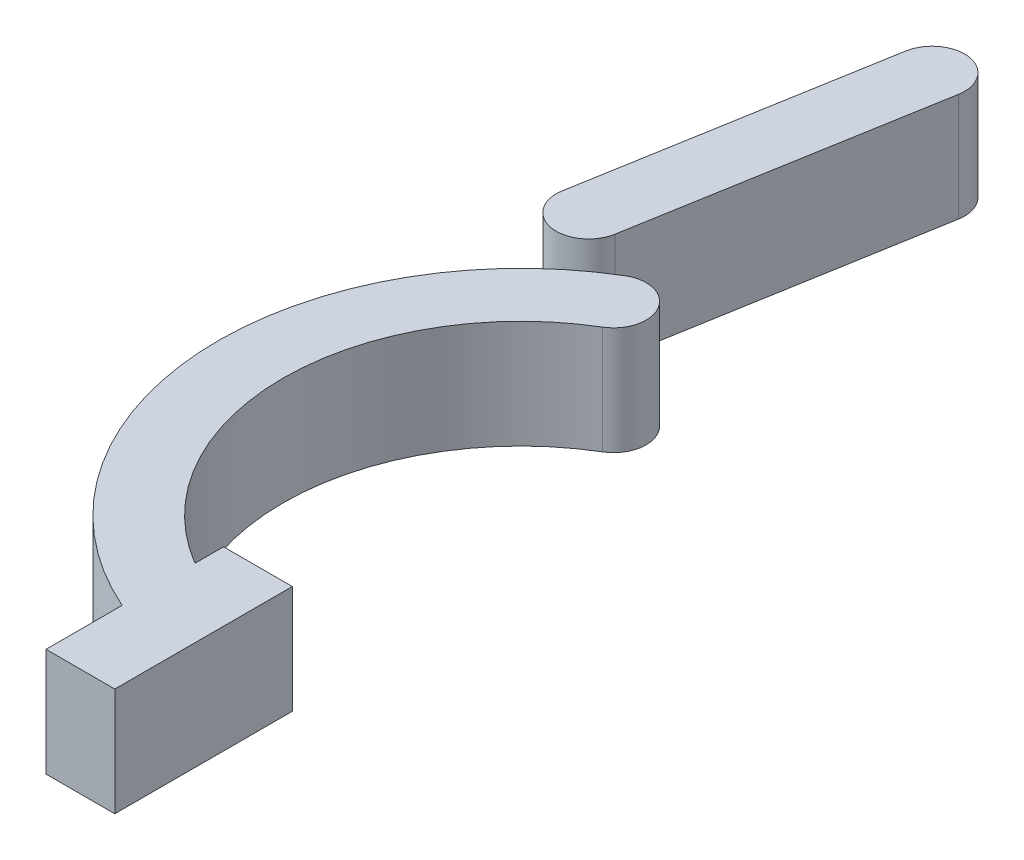
ISO-10303-21;
HEADER;
FILE_DESCRIPTION(('STEP AP214'),'2;1');
FILE_NAME('part.step','',(''),(''),'','','');
FILE_SCHEMA(('AUTOMOTIVE_DESIGN { 1 0 10303 214 1 1 1 1 }'));
ENDSEC;
DATA;
#1=APPLICATION_CONTEXT('core data for automotive mechanical design processes');
#2=APPLICATION_PROTOCOL_DEFINITION('international standard','automotive_design',2000,#1);
#3=PRODUCT_CONTEXT('',#1,'mechanical');
#4=PRODUCT('Part','Part','',(#3));
#5=PRODUCT_RELATED_PRODUCT_CATEGORY('part','',(#4));
#6=PRODUCT_DEFINITION_FORMATION('','',#4);
#7=PRODUCT_DEFINITION_CONTEXT('part definition',#1,'design');
#8=PRODUCT_DEFINITION('design','',#6,#7);
#9=PRODUCT_DEFINITION_SHAPE('','',#8);
#10=(LENGTH_UNIT() NAMED_UNIT(*) SI_UNIT(.MILLI.,.METRE.));
#11=(NAMED_UNIT(*) PLANE_ANGLE_UNIT() SI_UNIT($,.RADIAN.));
#12=(NAMED_UNIT(*) SI_UNIT($,.STERADIAN.) SOLID_ANGLE_UNIT());
#13=UNCERTAINTY_MEASURE_WITH_UNIT(LENGTH_MEASURE(1.E-05),#10,'distance_accuracy_value','');
#14=(GEOMETRIC_REPRESENTATION_CONTEXT(3) GLOBAL_UNCERTAINTY_ASSIGNED_CONTEXT((#13)) GLOBAL_UNIT_ASSIGNED_CONTEXT((#10,
#11,#12)) REPRESENTATION_CONTEXT('',''));
#15=CARTESIAN_POINT('',(0.,0.,0.));
#16=DIRECTION('',(0.,0.,1.));
#17=DIRECTION('',(1.,0.,0.));
#18=AXIS2_PLACEMENT_3D('',#15,#16,#17);
#19=CARTESIAN_POINT('',(-7.28902285763554,5.,0.));
#20=DIRECTION('',(1.,0.,0.));
#21=DIRECTION('',(0.,0.,-1.));
#22=AXIS2_PLACEMENT_3D('',#19,#20,#21);
#23=PLANE('',#22);
#24=DIRECTION('',(0.,0.,1.));
#25=VECTOR('',#24,1.);
#26=CARTESIAN_POINT('',(-7.28902285763554,-5.,0.));
#27=LINE('',#26,#25);
#28=CARTESIAN_POINT('',(-7.28902285763554,-5.,87.5621443156173));
#29=VERTEX_POINT('',#28);
#30=CARTESIAN_POINT('',(-7.28902285763554,-5.,94.6121393963154));
#31=VERTEX_POINT('',#30);
#32=EDGE_CURVE('E195',#29,#31,#27,.T.);
#33=ORIENTED_EDGE('',*,*,#32,.T.);
#34=DIRECTION('',(0.,-1.,0.));
#35=VECTOR('',#34,1.);
#36=CARTESIAN_POINT('',(-7.28902285763554,5.,94.6121393963154));
#37=LINE('',#36,#35);
#38=CARTESIAN_POINT('',(-7.28902285763554,5.,94.6121393963154));
#39=VERTEX_POINT('',#38);
#40=EDGE_CURVE('E178',#39,#31,#37,.T.);
#41=ORIENTED_EDGE('',*,*,#40,.F.);
#42=DIRECTION('',(0.,0.,1.));
#43=VECTOR('',#42,1.);
#44=CARTESIAN_POINT('',(-7.28902285763554,5.,0.));
#45=LINE('',#44,#43);
#46=CARTESIAN_POINT('',(-7.28902285763554,5.,87.5621443156173));
#47=VERTEX_POINT('',#46);
#48=EDGE_CURVE('E111',#47,#39,#45,.T.);
#49=ORIENTED_EDGE('',*,*,#48,.F.);
#50=DIRECTION('',(0.,-1.,0.));
#51=VECTOR('',#50,1.);
#52=CARTESIAN_POINT('',(-7.28902285763554,5.,87.5621443156173));
#53=LINE('',#52,#51);
#54=EDGE_CURVE('E173',#47,#29,#53,.T.);
#55=ORIENTED_EDGE('',*,*,#54,.T.);
#56=EDGE_LOOP('',(#33,#41,#49,#55));
#57=FACE_BOUND('',#56,.T.);
#58=ADVANCED_FACE('F107',(#57),#23,.F.);
#59=CARTESIAN_POINT('',(0.,5.,94.6121393963154));
#60=DIRECTION('',(0.,0.,-1.));
#61=DIRECTION('',(-1.,0.,0.));
#62=AXIS2_PLACEMENT_3D('',#59,#60,#61);
#63=PLANE('',#62);
#64=DIRECTION('',(1.,0.,0.));
#65=VECTOR('',#64,1.);
#66=CARTESIAN_POINT('',(0.,-5.,94.6121393963154));
#67=LINE('',#66,#65);
#68=CARTESIAN_POINT('',(-0.926080019048051,-5.,94.6121393963154));
#69=VERTEX_POINT('',#68);
#70=EDGE_CURVE('E218',#31,#69,#67,.T.);
#71=ORIENTED_EDGE('',*,*,#70,.T.);
#72=DIRECTION('',(0.,-1.,0.));
#73=VECTOR('',#72,1.);
#74=CARTESIAN_POINT('',(-0.926080019048051,5.,94.6121393963154));
#75=LINE('',#74,#73);
#76=CARTESIAN_POINT('',(-0.926080019048051,5.,94.6121393963154));
#77=VERTEX_POINT('',#76);
#78=EDGE_CURVE('E228',#77,#69,#75,.T.);
#79=ORIENTED_EDGE('',*,*,#78,.F.);
#80=DIRECTION('',(1.,0.,0.));
#81=VECTOR('',#80,1.);
#82=CARTESIAN_POINT('',(0.,5.,94.6121393963154));
#83=LINE('',#82,#81);
#84=EDGE_CURVE('E190',#39,#77,#83,.T.);
#85=ORIENTED_EDGE('',*,*,#84,.F.);
#86=ORIENTED_EDGE('',*,*,#40,.T.);
#87=EDGE_LOOP('',(#71,#79,#85,#86));
#88=FACE_BOUND('',#87,.T.);
#89=ADVANCED_FACE('F246',(#88),#63,.F.);
#90=CARTESIAN_POINT('',(-0.926080019048061,5.,0.));
#91=DIRECTION('',(1.,0.,0.));
#92=DIRECTION('',(0.,0.,-1.));
#93=AXIS2_PLACEMENT_3D('',#90,#91,#92);
#94=PLANE('',#93);
#95=DIRECTION('',(0.,0.,1.));
#96=VECTOR('',#95,1.);
#97=CARTESIAN_POINT('',(-0.926080019048061,-5.,0.));
#98=LINE('',#97,#96);
#99=CARTESIAN_POINT('',(-0.926080019048052,-5.,78.1853583946559));
#100=VERTEX_POINT('',#99);
#101=EDGE_CURVE('E215',#100,#69,#98,.T.);
#102=ORIENTED_EDGE('',*,*,#101,.F.);
#103=DIRECTION('',(0.,-1.,0.));
#104=VECTOR('',#103,1.);
#105=CARTESIAN_POINT('',(-0.926080019048052,5.,78.1853583946559));
#106=LINE('',#105,#104);
#107=CARTESIAN_POINT('',(-0.926080019048052,5.,78.1853583946559));
#108=VERTEX_POINT('',#107);
#109=EDGE_CURVE('E209',#108,#100,#106,.T.);
#110=ORIENTED_EDGE('',*,*,#109,.F.);
#111=DIRECTION('',(0.,0.,1.));
#112=VECTOR('',#111,1.);
#113=CARTESIAN_POINT('',(-0.926080019048061,5.,0.));
#114=LINE('',#113,#112);
#115=EDGE_CURVE('E196',#108,#77,#114,.T.);
#116=ORIENTED_EDGE('',*,*,#115,.T.);
#117=ORIENTED_EDGE('',*,*,#78,.T.);
#118=EDGE_LOOP('',(#102,#110,#116,#117));
#119=FACE_BOUND('',#118,.T.);
#120=ADVANCED_FACE('F226',(#119),#94,.T.);
#121=CARTESIAN_POINT('',(0.,5.,78.1853583946559));
#122=DIRECTION('',(0.,0.,-1.));
#123=DIRECTION('',(-1.,0.,0.));
#124=AXIS2_PLACEMENT_3D('',#121,#122,#123);
#125=PLANE('',#124);
#126=DIRECTION('',(1.,0.,0.));
#127=VECTOR('',#126,1.);
#128=CARTESIAN_POINT('',(0.,-5.,78.1853583946559));
#129=LINE('',#128,#127);
#130=CARTESIAN_POINT('',(-7.28902285763554,-5.,78.1853583946559));
#131=VERTEX_POINT('',#130);
#132=EDGE_CURVE('E193',#131,#100,#129,.T.);
#133=ORIENTED_EDGE('',*,*,#132,.F.);
#134=DIRECTION('',(0.,-1.,0.));
#135=VECTOR('',#134,1.);
#136=CARTESIAN_POINT('',(-7.28902285763554,5.,78.1853583946559));
#137=LINE('',#136,#135);
#138=CARTESIAN_POINT('',(-7.28902285763554,5.,78.1853583946559));
#139=VERTEX_POINT('',#138);
#140=EDGE_CURVE('E203',#139,#131,#137,.T.);
#141=ORIENTED_EDGE('',*,*,#140,.F.);
#142=DIRECTION('',(1.,0.,0.));
#143=VECTOR('',#142,1.);
#144=CARTESIAN_POINT('',(0.,5.,78.1853583946559));
#145=LINE('',#144,#143);
#146=EDGE_CURVE('E197',#139,#108,#145,.T.);
#147=ORIENTED_EDGE('',*,*,#146,.T.);
#148=ORIENTED_EDGE('',*,*,#109,.T.);
#149=EDGE_LOOP('',(#133,#141,#147,#148));
#150=FACE_BOUND('',#149,.T.);
#151=ADVANCED_FACE('F231',(#150),#125,.T.);
#152=CARTESIAN_POINT('',(-7.28902285763554,-5.,80.8299342788037));
#153=VERTEX_POINT('',#152);
#154=EDGE_CURVE('E189',#131,#153,#27,.T.);
#155=ORIENTED_EDGE('',*,*,#154,.T.);
#156=DIRECTION('',(0.,-1.,0.));
#157=VECTOR('',#156,1.);
#158=CARTESIAN_POINT('',(-7.28902285763554,5.,80.8299342788037));
#159=LINE('',#158,#157);
#160=CARTESIAN_POINT('',(-7.28902285763554,5.,80.8299342788037));
#161=VERTEX_POINT('',#160);
#162=EDGE_CURVE('E198',#161,#153,#159,.T.);
#163=ORIENTED_EDGE('',*,*,#162,.F.);
#164=EDGE_CURVE('E191',#139,#161,#45,.T.);
#165=ORIENTED_EDGE('',*,*,#164,.F.);
#166=ORIENTED_EDGE('',*,*,#140,.T.);
#167=EDGE_LOOP('',(#155,#163,#165,#166));
#168=FACE_BOUND('',#167,.T.);
#169=ADVANCED_FACE('F234',(#168),#23,.F.);
#170=CARTESIAN_POINT('',(0.,-5.,0.));
#171=DIRECTION('',(0.,1.,0.));
#172=DIRECTION('',(0.,0.,1.));
#173=AXIS2_PLACEMENT_3D('',#170,#171,#172);
#174=PLANE('',#173);
#175=ORIENTED_EDGE('',*,*,#32,.F.);
#176=CARTESIAN_POINT('',(3.94613789908462,-5.,61.9150945287382));
#177=DIRECTION('',(0.,1.,0.));
#178=DIRECTION('',(0.,0.,1.));
#179=AXIS2_PLACEMENT_3D('',#176,#177,#178);
#180=CIRCLE('',#179,28.);
#181=CARTESIAN_POINT('',(-10.4438399409068,-5.,37.8957577817638));
#182=VERTEX_POINT('',#181);
#183=EDGE_CURVE('E117',#182,#29,#180,.T.);
#184=ORIENTED_EDGE('',*,*,#183,.F.);
#185=CARTESIAN_POINT('',(-8.90205660090769,-5.,40.469258147511));
#186=DIRECTION('',(0.,1.,0.));
#187=DIRECTION('',(0.,0.,1.));
#188=AXIS2_PLACEMENT_3D('',#185,#186,#187);
#189=CIRCLE('',#188,3.);
#190=CARTESIAN_POINT('',(-7.36027326090861,-5.,43.0427585132583));
#191=VERTEX_POINT('',#190);
#192=EDGE_CURVE('E13',#191,#182,#189,.T.);
#193=ORIENTED_EDGE('',*,*,#192,.F.);
#194=CARTESIAN_POINT('',(3.94613789908462,-5.,61.9150945287382));
#195=DIRECTION('',(0.,1.,0.));
#196=DIRECTION('',(0.,0.,1.));
#197=AXIS2_PLACEMENT_3D('',#194,#195,#196);
#198=CIRCLE('',#197,22.);
#199=EDGE_CURVE('E241',#191,#153,#198,.T.);
#200=ORIENTED_EDGE('',*,*,#199,.T.);
#201=ORIENTED_EDGE('',*,*,#154,.F.);
#202=ORIENTED_EDGE('',*,*,#132,.T.);
#203=ORIENTED_EDGE('',*,*,#101,.T.);
#204=ORIENTED_EDGE('',*,*,#70,.F.);
#205=EDGE_LOOP('',(#175,#184,#193,#200,#201,#202,#203,#204));
#206=FACE_BOUND('',#205,.T.);
#207=ADVANCED_FACE('F247',(#206),#174,.F.);
#208=CARTESIAN_POINT('',(0.,5.,0.));
#209=DIRECTION('',(0.,1.,0.));
#210=DIRECTION('',(0.,0.,1.));
#211=AXIS2_PLACEMENT_3D('',#208,#209,#210);
#212=PLANE('',#211);
#213=ORIENTED_EDGE('',*,*,#164,.T.);
#214=CARTESIAN_POINT('',(3.94613789908462,5.,61.9150945287382));
#215=DIRECTION('',(0.,1.,0.));
#216=DIRECTION('',(0.,0.,1.));
#217=AXIS2_PLACEMENT_3D('',#214,#215,#216);
#218=CIRCLE('',#217,22.);
#219=CARTESIAN_POINT('',(-7.36027326090861,5.,43.0427585132583));
#220=VERTEX_POINT('',#219);
#221=EDGE_CURVE('E185',#220,#161,#218,.T.);
#222=ORIENTED_EDGE('',*,*,#221,.F.);
#223=CARTESIAN_POINT('',(-8.90205660090769,5.,40.469258147511));
#224=DIRECTION('',(0.,1.,0.));
#225=DIRECTION('',(0.,0.,1.));
#226=AXIS2_PLACEMENT_3D('',#223,#224,#225);
#227=CIRCLE('',#226,3.);
#228=CARTESIAN_POINT('',(-10.4438399409068,5.,37.8957577817638));
#229=VERTEX_POINT('',#228);
#230=EDGE_CURVE('E183',#220,#229,#227,.T.);
#231=ORIENTED_EDGE('',*,*,#230,.T.);
#232=CARTESIAN_POINT('',(3.94613789908462,5.,61.9150945287382));
#233=DIRECTION('',(0.,1.,0.));
#234=DIRECTION('',(0.,0.,1.));
#235=AXIS2_PLACEMENT_3D('',#232,#233,#234);
#236=CIRCLE('',#235,28.);
#237=EDGE_CURVE('E175',#229,#47,#236,.T.);
#238=ORIENTED_EDGE('',*,*,#237,.T.);
#239=ORIENTED_EDGE('',*,*,#48,.T.);
#240=ORIENTED_EDGE('',*,*,#84,.T.);
#241=ORIENTED_EDGE('',*,*,#115,.F.);
#242=ORIENTED_EDGE('',*,*,#146,.F.);
#243=EDGE_LOOP('',(#213,#222,#231,#238,#239,#240,#241,#242));
#244=FACE_BOUND('',#243,.T.);
#245=ADVANCED_FACE('F109',(#244),#212,.T.);
#246=CARTESIAN_POINT('',(3.94613789908462,5.,61.9150945287382));
#247=DIRECTION('',(0.,-1.,0.));
#248=DIRECTION('',(0.,0.,-1.));
#249=AXIS2_PLACEMENT_3D('',#246,#247,#248);
#250=CYLINDRICAL_SURFACE('',#249,28.);
#251=ORIENTED_EDGE('',*,*,#183,.T.);
#252=ORIENTED_EDGE('',*,*,#54,.F.);
#253=ORIENTED_EDGE('',*,*,#237,.F.);
#254=DIRECTION('',(0.,-1.,0.));
#255=VECTOR('',#254,1.);
#256=CARTESIAN_POINT('',(-10.4438399409068,5.,37.8957577817638));
#257=LINE('',#256,#255);
#258=EDGE_CURVE('E220',#229,#182,#257,.T.);
#259=ORIENTED_EDGE('',*,*,#258,.T.);
#260=EDGE_LOOP('',(#251,#252,#253,#259));
#261=FACE_BOUND('',#260,.T.);
#262=ADVANCED_FACE('F174',(#261),#250,.T.);
#263=CARTESIAN_POINT('',(3.94613789908462,5.,61.9150945287382));
#264=DIRECTION('',(0.,-1.,0.));
#265=DIRECTION('',(0.,0.,-1.));
#266=AXIS2_PLACEMENT_3D('',#263,#264,#265);
#267=CYLINDRICAL_SURFACE('',#266,22.);
#268=ORIENTED_EDGE('',*,*,#221,.T.);
#269=ORIENTED_EDGE('',*,*,#162,.T.);
#270=ORIENTED_EDGE('',*,*,#199,.F.);
#271=DIRECTION('',(0.,-1.,0.));
#272=VECTOR('',#271,1.);
#273=CARTESIAN_POINT('',(-7.36027326090861,5.,43.0427585132583));
#274=LINE('',#273,#272);
#275=EDGE_CURVE('E236',#220,#191,#274,.T.);
#276=ORIENTED_EDGE('',*,*,#275,.F.);
#277=EDGE_LOOP('',(#268,#269,#270,#276));
#278=FACE_BOUND('',#277,.T.);
#279=ADVANCED_FACE('F235',(#278),#267,.F.);
#280=CARTESIAN_POINT('',(-8.90205660090769,5.,40.469258147511));
#281=DIRECTION('',(0.,-1.,0.));
#282=DIRECTION('',(0.,0.,-1.));
#283=AXIS2_PLACEMENT_3D('',#280,#281,#282);
#284=CYLINDRICAL_SURFACE('',#283,3.);
#285=ORIENTED_EDGE('',*,*,#192,.T.);
#286=ORIENTED_EDGE('',*,*,#258,.F.);
#287=ORIENTED_EDGE('',*,*,#230,.F.);
#288=ORIENTED_EDGE('',*,*,#275,.T.);
#289=EDGE_LOOP('',(#285,#286,#287,#288));
#290=FACE_BOUND('',#289,.T.);
#291=ADVANCED_FACE('F251',(#290),#284,.T.);
#292=CLOSED_SHELL('',(#58,#89,#120,#151,#169,#207,#245,#262,#279,#291));
#293=MANIFOLD_SOLID_BREP('B2',#292);
#294=CARTESIAN_POINT('',(-13.8490028032888,5.,-2.39439380301712));
#295=DIRECTION('',(0.985380967276343,0.,0.170365340751984));
#296=DIRECTION('',(0.170365340751984,0.,-0.985380967276343));
#297=AXIS2_PLACEMENT_3D('',#294,#295,#296);
#298=PLANE('',#297);
#299=DIRECTION('',(-0.170365340751984,0.,0.985380967276343));
#300=VECTOR('',#299,1.);
#301=CARTESIAN_POINT('',(-13.8490028032888,-5.,-2.39439380301712));
#302=LINE('',#301,#300);
#303=CARTESIAN_POINT('',(-15.456142901829,-5.,6.9011897814021));
#304=VERTEX_POINT('',#303);
#305=CARTESIAN_POINT('',(-20.1411897725086,-5.,33.9991663815015));
#306=VERTEX_POINT('',#305);
#307=EDGE_CURVE('E394',#304,#306,#302,.T.);
#308=ORIENTED_EDGE('',*,*,#307,.T.);
#309=DIRECTION('',(0.,-1.,0.));
#310=VECTOR('',#309,1.);
#311=CARTESIAN_POINT('',(-20.1411897725086,5.,33.9991663815015));
#312=LINE('',#311,#310);
#313=CARTESIAN_POINT('',(-20.1411897725086,5.,33.9991663815015));
#314=VERTEX_POINT('',#313);
#315=EDGE_CURVE('E105',#314,#306,#312,.T.);
#316=ORIENTED_EDGE('',*,*,#315,.F.);
#317=DIRECTION('',(-0.170365340751984,0.,0.985380967276343));
#318=VECTOR('',#317,1.);
#319=CARTESIAN_POINT('',(-13.8490028032888,5.,-2.39439380301712));
#320=LINE('',#319,#318);
#321=CARTESIAN_POINT('',(-15.456142901829,5.,6.9011897814021));
#322=VERTEX_POINT('',#321);
#323=EDGE_CURVE('E379',#322,#314,#320,.T.);
#324=ORIENTED_EDGE('',*,*,#323,.F.);
#325=DIRECTION('',(0.,-1.,0.));
#326=VECTOR('',#325,1.);
#327=CARTESIAN_POINT('',(-15.456142901829,5.,6.9011897814021));
#328=LINE('',#327,#326);
#329=EDGE_CURVE('E390',#322,#304,#328,.T.);
#330=ORIENTED_EDGE('',*,*,#329,.T.);
#331=EDGE_LOOP('',(#308,#316,#324,#330));
#332=FACE_BOUND('',#331,.T.);
#333=ADVANCED_FACE('F332',(#332),#298,.F.);
#334=CARTESIAN_POINT('',(-17.1850468706796,5.,34.5102624037575));
#335=DIRECTION('',(0.,-1.,0.));
#336=DIRECTION('',(0.,0.,-1.));
#337=AXIS2_PLACEMENT_3D('',#334,#335,#336);
#338=CYLINDRICAL_SURFACE('',#337,3.);
#339=CARTESIAN_POINT('',(-17.1850468706796,-5.,34.5102624037575));
#340=DIRECTION('',(0.,1.,0.));
#341=DIRECTION('',(0.,0.,1.));
#342=AXIS2_PLACEMENT_3D('',#339,#340,#341);
#343=CIRCLE('',#342,3.);
#344=CARTESIAN_POINT('',(-14.2289039688505,-5.,35.0213584260134));
#345=VERTEX_POINT('',#344);
#346=EDGE_CURVE('E384',#306,#345,#343,.T.);
#347=ORIENTED_EDGE('',*,*,#346,.T.);
#348=DIRECTION('',(0.,-1.,0.));
#349=VECTOR('',#348,1.);
#350=CARTESIAN_POINT('',(-14.2289039688505,5.,35.0213584260134));
#351=LINE('',#350,#349);
#352=CARTESIAN_POINT('',(-14.2289039688505,5.,35.0213584260134));
#353=VERTEX_POINT('',#352);
#354=EDGE_CURVE('E340',#353,#345,#351,.T.);
#355=ORIENTED_EDGE('',*,*,#354,.F.);
#356=CARTESIAN_POINT('',(-17.1850468706796,5.,34.5102624037575));
#357=DIRECTION('',(0.,1.,0.));
#358=DIRECTION('',(0.,0.,1.));
#359=AXIS2_PLACEMENT_3D('',#356,#357,#358);
#360=CIRCLE('',#359,3.);
#361=EDGE_CURVE('E374',#314,#353,#360,.T.);
#362=ORIENTED_EDGE('',*,*,#361,.F.);
#363=ORIENTED_EDGE('',*,*,#315,.T.);
#364=EDGE_LOOP('',(#347,#355,#362,#363));
#365=FACE_BOUND('',#364,.T.);
#366=ADVANCED_FACE('F383',(#365),#338,.T.);
#367=CARTESIAN_POINT('',(-7.93671699963079,5.,-1.37220175850521));
#368=DIRECTION('',(0.985380967276343,0.,0.170365340751984));
#369=DIRECTION('',(0.170365340751984,0.,-0.985380967276343));
#370=AXIS2_PLACEMENT_3D('',#367,#368,#369);
#371=PLANE('',#370);
#372=DIRECTION('',(-0.170365340751984,0.,0.985380967276343));
#373=VECTOR('',#372,1.);
#374=CARTESIAN_POINT('',(-7.93671699963079,-5.,-1.37220175850521));
#375=LINE('',#374,#373);
#376=CARTESIAN_POINT('',(-9.54385709817098,-5.,7.92338182591401));
#377=VERTEX_POINT('',#376);
#378=EDGE_CURVE('E398',#377,#345,#375,.T.);
#379=ORIENTED_EDGE('',*,*,#378,.F.);
#380=DIRECTION('',(0.,-1.,0.));
#381=VECTOR('',#380,1.);
#382=CARTESIAN_POINT('',(-9.54385709817098,5.,7.92338182591401));
#383=LINE('',#382,#381);
#384=CARTESIAN_POINT('',(-9.54385709817098,5.,7.92338182591401));
#385=VERTEX_POINT('',#384);
#386=EDGE_CURVE('E364',#385,#377,#383,.T.);
#387=ORIENTED_EDGE('',*,*,#386,.F.);
#388=DIRECTION('',(-0.170365340751984,0.,0.985380967276343));
#389=VECTOR('',#388,1.);
#390=CARTESIAN_POINT('',(-7.93671699963079,5.,-1.37220175850521));
#391=LINE('',#390,#389);
#392=EDGE_CURVE('E377',#385,#353,#391,.T.);
#393=ORIENTED_EDGE('',*,*,#392,.T.);
#394=ORIENTED_EDGE('',*,*,#354,.T.);
#395=EDGE_LOOP('',(#379,#387,#393,#394));
#396=FACE_BOUND('',#395,.T.);
#397=ADVANCED_FACE('F388',(#396),#371,.T.);
#398=CARTESIAN_POINT('',(-12.5,5.,7.41228580365806));
#399=DIRECTION('',(0.,-1.,0.));
#400=DIRECTION('',(0.,0.,-1.));
#401=AXIS2_PLACEMENT_3D('',#398,#399,#400);
#402=CYLINDRICAL_SURFACE('',#401,3.);
#403=CARTESIAN_POINT('',(-12.5,-5.,7.41228580365806));
#404=DIRECTION('',(0.,1.,0.));
#405=DIRECTION('',(0.,0.,1.));
#406=AXIS2_PLACEMENT_3D('',#403,#404,#405);
#407=CIRCLE('',#406,3.);
#408=EDGE_CURVE('E367',#377,#304,#407,.T.);
#409=ORIENTED_EDGE('',*,*,#408,.T.);
#410=ORIENTED_EDGE('',*,*,#329,.F.);
#411=CARTESIAN_POINT('',(-12.5,5.,7.41228580365806));
#412=DIRECTION('',(0.,1.,0.));
#413=DIRECTION('',(0.,0.,1.));
#414=AXIS2_PLACEMENT_3D('',#411,#412,#413);
#415=CIRCLE('',#414,3.);
#416=EDGE_CURVE('E348',#385,#322,#415,.T.);
#417=ORIENTED_EDGE('',*,*,#416,.F.);
#418=ORIENTED_EDGE('',*,*,#386,.T.);
#419=EDGE_LOOP('',(#409,#410,#417,#418));
#420=FACE_BOUND('',#419,.T.);
#421=ADVANCED_FACE('F411',(#420),#402,.T.);
#422=CARTESIAN_POINT('',(0.,5.,0.));
#423=DIRECTION('',(0.,1.,0.));
#424=DIRECTION('',(0.,0.,1.));
#425=AXIS2_PLACEMENT_3D('',#422,#423,#424);
#426=PLANE('',#425);
#427=ORIENTED_EDGE('',*,*,#323,.T.);
#428=ORIENTED_EDGE('',*,*,#361,.T.);
#429=ORIENTED_EDGE('',*,*,#392,.F.);
#430=ORIENTED_EDGE('',*,*,#416,.T.);
#431=EDGE_LOOP('',(#427,#428,#429,#430));
#432=FACE_BOUND('',#431,.T.);
#433=ADVANCED_FACE('F375',(#432),#426,.T.);
#434=CARTESIAN_POINT('',(0.,-5.,0.));
#435=DIRECTION('',(0.,1.,0.));
#436=DIRECTION('',(0.,0.,1.));
#437=AXIS2_PLACEMENT_3D('',#434,#435,#436);
#438=PLANE('',#437);
#439=ORIENTED_EDGE('',*,*,#307,.F.);
#440=ORIENTED_EDGE('',*,*,#408,.F.);
#441=ORIENTED_EDGE('',*,*,#378,.T.);
#442=ORIENTED_EDGE('',*,*,#346,.F.);
#443=EDGE_LOOP('',(#439,#440,#441,#442));
#444=FACE_BOUND('',#443,.T.);
#445=ADVANCED_FACE('F405',(#444),#438,.F.);
#446=CLOSED_SHELL('',(#333,#366,#397,#421,#433,#445));
#447=MANIFOLD_SOLID_BREP('B7',#446);
#448=ADVANCED_BREP_SHAPE_REPRESENTATION('',(#18,#293,#447),#14);
#449=SHAPE_DEFINITION_REPRESENTATION(#9,#448);
ENDSEC;
END-ISO-10303-21;
